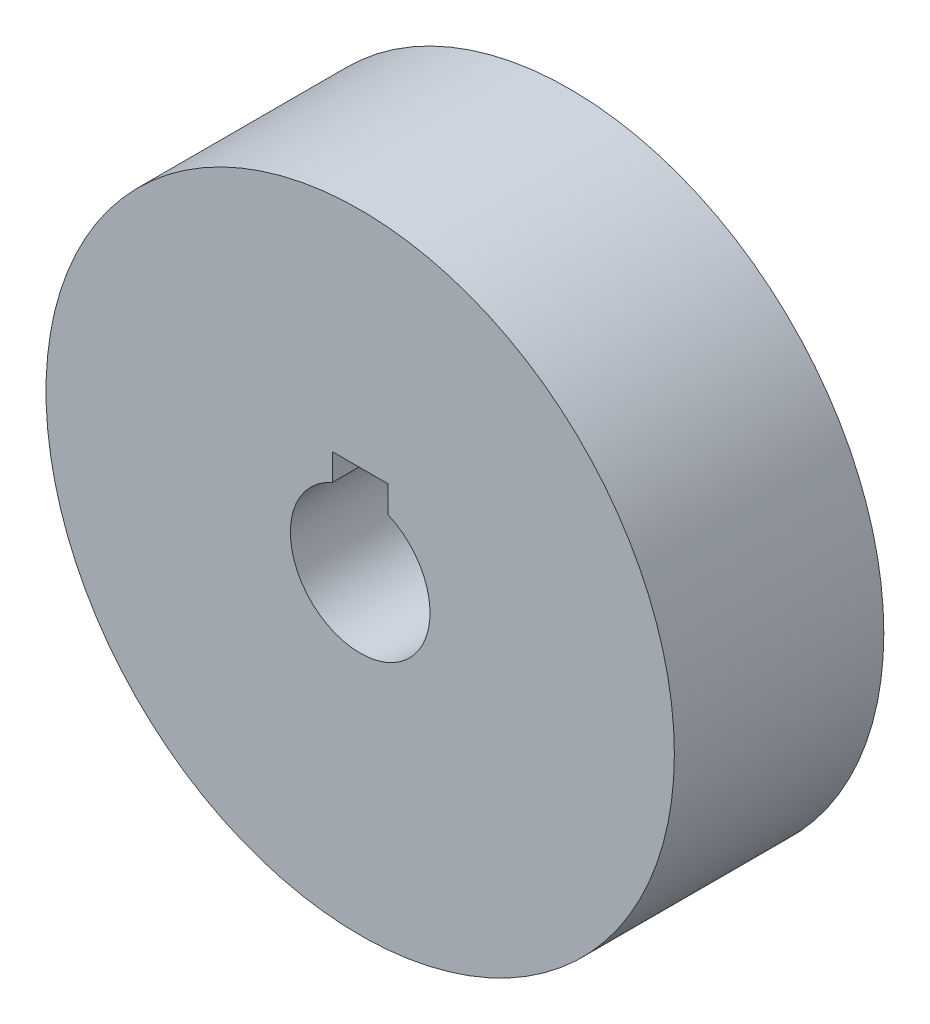
ISO-10303-21;
HEADER;
FILE_DESCRIPTION(('STEP AP214'),'2;1');
FILE_NAME('part.step','',(''),(''),'','','');
FILE_SCHEMA(('AUTOMOTIVE_DESIGN { 1 0 10303 214 1 1 1 1 }'));
ENDSEC;
DATA;
#1=APPLICATION_CONTEXT('core data for automotive mechanical design processes');
#2=APPLICATION_PROTOCOL_DEFINITION('international standard','automotive_design',2000,#1);
#3=PRODUCT_CONTEXT('',#1,'mechanical');
#4=PRODUCT('Part','Part','',(#3));
#5=PRODUCT_RELATED_PRODUCT_CATEGORY('part','',(#4));
#6=PRODUCT_DEFINITION_FORMATION('','',#4);
#7=PRODUCT_DEFINITION_CONTEXT('part definition',#1,'design');
#8=PRODUCT_DEFINITION('design','',#6,#7);
#9=PRODUCT_DEFINITION_SHAPE('','',#8);
#10=(LENGTH_UNIT() NAMED_UNIT(*) SI_UNIT(.MILLI.,.METRE.));
#11=(NAMED_UNIT(*) PLANE_ANGLE_UNIT() SI_UNIT($,.RADIAN.));
#12=(NAMED_UNIT(*) SI_UNIT($,.STERADIAN.) SOLID_ANGLE_UNIT());
#13=UNCERTAINTY_MEASURE_WITH_UNIT(LENGTH_MEASURE(1.E-05),#10,'distance_accuracy_value','');
#14=(GEOMETRIC_REPRESENTATION_CONTEXT(3) GLOBAL_UNCERTAINTY_ASSIGNED_CONTEXT((#13)) GLOBAL_UNIT_ASSIGNED_CONTEXT((#10,
#11,#12)) REPRESENTATION_CONTEXT('',''));
#15=CARTESIAN_POINT('',(0.,0.,0.));
#16=DIRECTION('',(0.,0.,1.));
#17=DIRECTION('',(1.,0.,0.));
#18=AXIS2_PLACEMENT_3D('',#15,#16,#17);
#19=CARTESIAN_POINT('',(0.,0.,30.));
#20=DIRECTION('',(0.,0.,1.));
#21=DIRECTION('',(1.,0.,0.));
#22=AXIS2_PLACEMENT_3D('',#19,#20,#21);
#23=PLANE('',#22);
#24=CARTESIAN_POINT('',(0.,0.,30.));
#25=DIRECTION('',(0.,0.,1.));
#26=DIRECTION('',(1.,0.,0.));
#27=AXIS2_PLACEMENT_3D('',#24,#25,#26);
#28=CIRCLE('',#27,45.);
#29=CARTESIAN_POINT('',(45.,0.,30.));
#30=VERTEX_POINT('',#29);
#31=EDGE_CURVE('E11',#30,#30,#28,.T.);
#32=ORIENTED_EDGE('',*,*,#31,.T.);
#33=EDGE_LOOP('',(#32));
#34=FACE_BOUND('',#33,.T.);
#35=DIRECTION('',(0.,1.,0.));
#36=VECTOR('',#35,1.);
#37=CARTESIAN_POINT('',(4.,9.16515138991168,30.));
#38=LINE('',#37,#36);
#39=CARTESIAN_POINT('',(4.,9.16515138991168,30.));
#40=VERTEX_POINT('',#39);
#41=CARTESIAN_POINT('',(4.,13.,30.));
#42=VERTEX_POINT('',#41);
#43=EDGE_CURVE('E84',#40,#42,#38,.T.);
#44=ORIENTED_EDGE('',*,*,#43,.F.);
#45=CARTESIAN_POINT('',(0.,0.,30.));
#46=DIRECTION('',(0.,0.,1.));
#47=DIRECTION('',(1.,0.,0.));
#48=AXIS2_PLACEMENT_3D('',#45,#46,#47);
#49=CIRCLE('',#48,10.);
#50=CARTESIAN_POINT('',(-4.,9.16515138991168,30.));
#51=VERTEX_POINT('',#50);
#52=EDGE_CURVE('E76',#51,#40,#49,.T.);
#53=ORIENTED_EDGE('',*,*,#52,.F.);
#54=DIRECTION('',(0.,-1.,0.));
#55=VECTOR('',#54,1.);
#56=CARTESIAN_POINT('',(-4.,13.,30.));
#57=LINE('',#56,#55);
#58=CARTESIAN_POINT('',(-4.,13.,30.));
#59=VERTEX_POINT('',#58);
#60=EDGE_CURVE('E97',#59,#51,#57,.T.);
#61=ORIENTED_EDGE('',*,*,#60,.F.);
#62=DIRECTION('',(-1.,0.,0.));
#63=VECTOR('',#62,1.);
#64=CARTESIAN_POINT('',(4.,13.,30.));
#65=LINE('',#64,#63);
#66=EDGE_CURVE('E95',#42,#59,#65,.T.);
#67=ORIENTED_EDGE('',*,*,#66,.F.);
#68=EDGE_LOOP('',(#44,#53,#61,#67));
#69=FACE_BOUND('',#68,.T.);
#70=ADVANCED_FACE('F35',(#34,#69),#23,.T.);
#71=CARTESIAN_POINT('',(0.,0.,0.));
#72=DIRECTION('',(0.,0.,1.));
#73=DIRECTION('',(1.,0.,0.));
#74=AXIS2_PLACEMENT_3D('',#71,#72,#73);
#75=PLANE('',#74);
#76=CARTESIAN_POINT('',(0.,0.,0.));
#77=DIRECTION('',(0.,0.,1.));
#78=DIRECTION('',(1.,0.,0.));
#79=AXIS2_PLACEMENT_3D('',#76,#77,#78);
#80=CIRCLE('',#79,45.);
#81=CARTESIAN_POINT('',(45.,0.,0.));
#82=VERTEX_POINT('',#81);
#83=EDGE_CURVE('E39',#82,#82,#80,.T.);
#84=ORIENTED_EDGE('',*,*,#83,.F.);
#85=EDGE_LOOP('',(#84));
#86=FACE_BOUND('',#85,.T.);
#87=CARTESIAN_POINT('',(0.,0.,0.));
#88=DIRECTION('',(0.,0.,1.));
#89=DIRECTION('',(1.,0.,0.));
#90=AXIS2_PLACEMENT_3D('',#87,#88,#89);
#91=CIRCLE('',#90,10.);
#92=CARTESIAN_POINT('',(-4.,9.16515138991168,0.));
#93=VERTEX_POINT('',#92);
#94=CARTESIAN_POINT('',(4.,9.16515138991168,0.));
#95=VERTEX_POINT('',#94);
#96=EDGE_CURVE('E58',#93,#95,#91,.T.);
#97=ORIENTED_EDGE('',*,*,#96,.T.);
#98=DIRECTION('',(0.,1.,0.));
#99=VECTOR('',#98,1.);
#100=CARTESIAN_POINT('',(4.,9.16515138991168,0.));
#101=LINE('',#100,#99);
#102=CARTESIAN_POINT('',(4.,13.,0.));
#103=VERTEX_POINT('',#102);
#104=EDGE_CURVE('E91',#95,#103,#101,.T.);
#105=ORIENTED_EDGE('',*,*,#104,.T.);
#106=DIRECTION('',(-1.,0.,0.));
#107=VECTOR('',#106,1.);
#108=CARTESIAN_POINT('',(4.,13.,0.));
#109=LINE('',#108,#107);
#110=CARTESIAN_POINT('',(-4.,13.,0.));
#111=VERTEX_POINT('',#110);
#112=EDGE_CURVE('E103',#103,#111,#109,.T.);
#113=ORIENTED_EDGE('',*,*,#112,.T.);
#114=DIRECTION('',(0.,-1.,0.));
#115=VECTOR('',#114,1.);
#116=CARTESIAN_POINT('',(-4.,13.,0.));
#117=LINE('',#116,#115);
#118=EDGE_CURVE('E85',#111,#93,#117,.T.);
#119=ORIENTED_EDGE('',*,*,#118,.T.);
#120=EDGE_LOOP('',(#97,#105,#113,#119));
#121=FACE_BOUND('',#120,.T.);
#122=ADVANCED_FACE('F114',(#86,#121),#75,.F.);
#123=CARTESIAN_POINT('',(0.,0.,30.));
#124=DIRECTION('',(0.,0.,-1.));
#125=DIRECTION('',(-1.,0.,0.));
#126=AXIS2_PLACEMENT_3D('',#123,#124,#125);
#127=CYLINDRICAL_SURFACE('',#126,45.);
#128=ORIENTED_EDGE('',*,*,#31,.F.);
#129=EDGE_LOOP('',(#128));
#130=FACE_BOUND('',#129,.T.);
#131=ORIENTED_EDGE('',*,*,#83,.T.);
#132=EDGE_LOOP('',(#131));
#133=FACE_BOUND('',#132,.T.);
#134=ADVANCED_FACE('F37',(#130,#133),#127,.T.);
#135=CARTESIAN_POINT('',(0.,0.,30.));
#136=DIRECTION('',(0.,0.,-1.));
#137=DIRECTION('',(-1.,0.,0.));
#138=AXIS2_PLACEMENT_3D('',#135,#136,#137);
#139=CYLINDRICAL_SURFACE('',#138,10.);
#140=ORIENTED_EDGE('',*,*,#96,.F.);
#141=DIRECTION('',(0.,0.,-1.));
#142=VECTOR('',#141,1.);
#143=CARTESIAN_POINT('',(-4.,9.16515138991168,30.));
#144=LINE('',#143,#142);
#145=EDGE_CURVE('E80',#51,#93,#144,.T.);
#146=ORIENTED_EDGE('',*,*,#145,.F.);
#147=ORIENTED_EDGE('',*,*,#52,.T.);
#148=DIRECTION('',(0.,0.,-1.));
#149=VECTOR('',#148,1.);
#150=CARTESIAN_POINT('',(4.,9.16515138991168,30.));
#151=LINE('',#150,#149);
#152=EDGE_CURVE('E79',#40,#95,#151,.T.);
#153=ORIENTED_EDGE('',*,*,#152,.T.);
#154=EDGE_LOOP('',(#140,#146,#147,#153));
#155=FACE_BOUND('',#154,.T.);
#156=ADVANCED_FACE('F78',(#155),#139,.F.);
#157=CARTESIAN_POINT('',(4.,9.16515138991168,30.));
#158=DIRECTION('',(-1.,0.,0.));
#159=DIRECTION('',(0.,-1.,0.));
#160=AXIS2_PLACEMENT_3D('',#157,#158,#159);
#161=PLANE('',#160);
#162=ORIENTED_EDGE('',*,*,#104,.F.);
#163=ORIENTED_EDGE('',*,*,#152,.F.);
#164=ORIENTED_EDGE('',*,*,#43,.T.);
#165=DIRECTION('',(0.,0.,-1.));
#166=VECTOR('',#165,1.);
#167=CARTESIAN_POINT('',(4.,13.,30.));
#168=LINE('',#167,#166);
#169=EDGE_CURVE('E92',#42,#103,#168,.T.);
#170=ORIENTED_EDGE('',*,*,#169,.T.);
#171=EDGE_LOOP('',(#162,#163,#164,#170));
#172=FACE_BOUND('',#171,.T.);
#173=ADVANCED_FACE('F88',(#172),#161,.T.);
#174=CARTESIAN_POINT('',(4.,13.,30.));
#175=DIRECTION('',(0.,-1.,0.));
#176=DIRECTION('',(0.,0.,-1.));
#177=AXIS2_PLACEMENT_3D('',#174,#175,#176);
#178=PLANE('',#177);
#179=ORIENTED_EDGE('',*,*,#112,.F.);
#180=ORIENTED_EDGE('',*,*,#169,.F.);
#181=ORIENTED_EDGE('',*,*,#66,.T.);
#182=DIRECTION('',(0.,0.,-1.));
#183=VECTOR('',#182,1.);
#184=CARTESIAN_POINT('',(-4.,13.,30.));
#185=LINE('',#184,#183);
#186=EDGE_CURVE('E50',#59,#111,#185,.T.);
#187=ORIENTED_EDGE('',*,*,#186,.T.);
#188=EDGE_LOOP('',(#179,#180,#181,#187));
#189=FACE_BOUND('',#188,.T.);
#190=ADVANCED_FACE('F112',(#189),#178,.T.);
#191=CARTESIAN_POINT('',(-4.,13.,30.));
#192=DIRECTION('',(1.,0.,0.));
#193=DIRECTION('',(0.,1.,0.));
#194=AXIS2_PLACEMENT_3D('',#191,#192,#193);
#195=PLANE('',#194);
#196=ORIENTED_EDGE('',*,*,#118,.F.);
#197=ORIENTED_EDGE('',*,*,#186,.F.);
#198=ORIENTED_EDGE('',*,*,#60,.T.);
#199=ORIENTED_EDGE('',*,*,#145,.T.);
#200=EDGE_LOOP('',(#196,#197,#198,#199));
#201=FACE_BOUND('',#200,.T.);
#202=ADVANCED_FACE('F115',(#201),#195,.T.);
#203=CLOSED_SHELL('',(#70,#122,#134,#156,#173,#190,#202));
#204=MANIFOLD_SOLID_BREP('B2',#203);
#205=ADVANCED_BREP_SHAPE_REPRESENTATION('',(#18,#204),#14);
#206=SHAPE_DEFINITION_REPRESENTATION(#9,#205);
ENDSEC;
END-ISO-10303-21;
